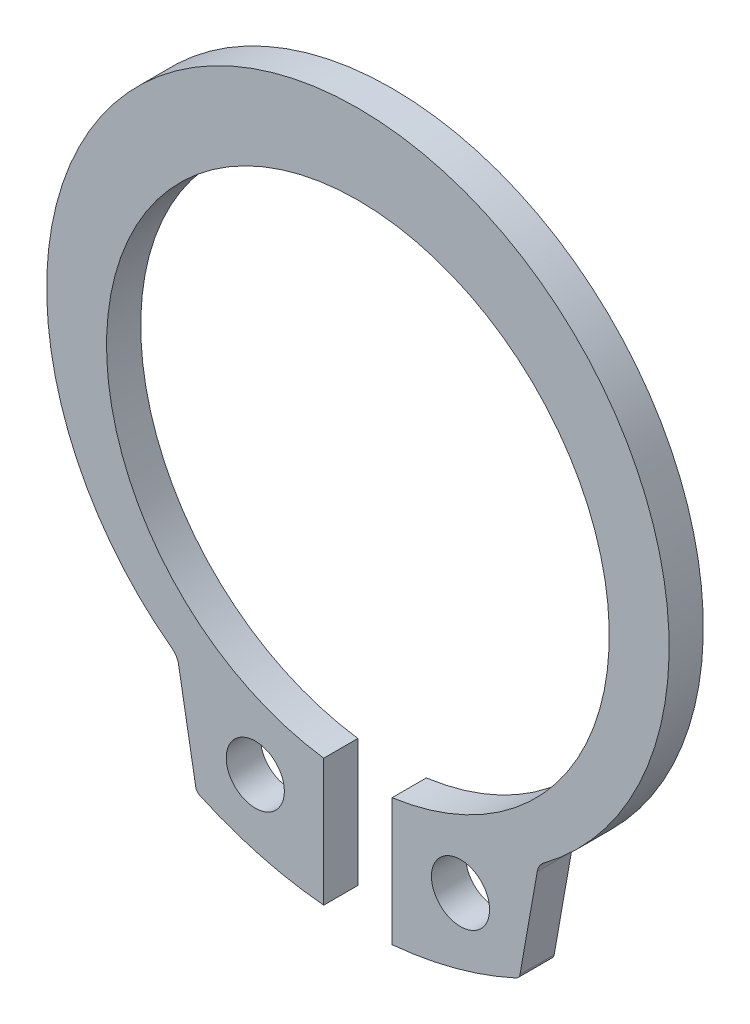
ISO-10303-21;
HEADER;
FILE_DESCRIPTION(('STEP AP214'),'2;1');
FILE_NAME('part.step','',(''),(''),'','','');
FILE_SCHEMA(('AUTOMOTIVE_DESIGN { 1 0 10303 214 1 1 1 1 }'));
ENDSEC;
DATA;
#1=APPLICATION_CONTEXT('core data for automotive mechanical design processes');
#2=APPLICATION_PROTOCOL_DEFINITION('international standard','automotive_design',2000,#1);
#3=PRODUCT_CONTEXT('',#1,'mechanical');
#4=PRODUCT('Part','Part','',(#3));
#5=PRODUCT_RELATED_PRODUCT_CATEGORY('part','',(#4));
#6=PRODUCT_DEFINITION_FORMATION('','',#4);
#7=PRODUCT_DEFINITION_CONTEXT('part definition',#1,'design');
#8=PRODUCT_DEFINITION('design','',#6,#7);
#9=PRODUCT_DEFINITION_SHAPE('','',#8);
#10=(LENGTH_UNIT() NAMED_UNIT(*) SI_UNIT(.MILLI.,.METRE.));
#11=(NAMED_UNIT(*) PLANE_ANGLE_UNIT() SI_UNIT($,.RADIAN.));
#12=(NAMED_UNIT(*) SI_UNIT($,.STERADIAN.) SOLID_ANGLE_UNIT());
#13=UNCERTAINTY_MEASURE_WITH_UNIT(LENGTH_MEASURE(1.E-05),#10,'distance_accuracy_value','');
#14=(GEOMETRIC_REPRESENTATION_CONTEXT(3) GLOBAL_UNCERTAINTY_ASSIGNED_CONTEXT((#13)) GLOBAL_UNIT_ASSIGNED_CONTEXT((#10,
#11,#12)) REPRESENTATION_CONTEXT('',''));
#15=CARTESIAN_POINT('',(0.,0.,0.));
#16=DIRECTION('',(0.,0.,1.));
#17=DIRECTION('',(1.,0.,0.));
#18=AXIS2_PLACEMENT_3D('',#15,#16,#17);
#19=CARTESIAN_POINT('',(0.,-0.58,-1.));
#20=DIRECTION('',(0.,0.,1.));
#21=DIRECTION('',(1.,0.,0.));
#22=AXIS2_PLACEMENT_3D('',#19,#20,#21);
#23=CYLINDRICAL_SURFACE('',#22,11.05);
#24=CARTESIAN_POINT('',(0.,-0.58,-1.));
#25=DIRECTION('',(0.,0.,1.));
#26=DIRECTION('',(-1.,0.,0.));
#27=AXIS2_PLACEMENT_3D('',#24,#25,#26);
#28=CIRCLE('',#27,11.05);
#29=CARTESIAN_POINT('',(1.,-11.5846581046391,-1.));
#30=VERTEX_POINT('',#29);
#31=CARTESIAN_POINT('',(4.62644946881988,-10.6148624959417,-1.));
#32=VERTEX_POINT('',#31);
#33=EDGE_CURVE('E174',#30,#32,#28,.T.);
#34=ORIENTED_EDGE('',*,*,#33,.T.);
#35=DIRECTION('',(0.,0.,1.));
#36=VECTOR('',#35,1.);
#37=CARTESIAN_POINT('',(4.62644946881988,-10.6148624959417,-1.));
#38=LINE('',#37,#36);
#39=CARTESIAN_POINT('',(4.62644946881988,-10.6148624959417,0.));
#40=VERTEX_POINT('',#39);
#41=EDGE_CURVE('E192',#32,#40,#38,.T.);
#42=ORIENTED_EDGE('',*,*,#41,.T.);
#43=CARTESIAN_POINT('',(0.,-0.58,0.));
#44=DIRECTION('',(0.,0.,1.));
#45=DIRECTION('',(-1.,0.,0.));
#46=AXIS2_PLACEMENT_3D('',#43,#44,#45);
#47=CIRCLE('',#46,11.05);
#48=CARTESIAN_POINT('',(1.,-11.5846581046391,0.));
#49=VERTEX_POINT('',#48);
#50=EDGE_CURVE('E154',#49,#40,#47,.T.);
#51=ORIENTED_EDGE('',*,*,#50,.F.);
#52=DIRECTION('',(0.,0.,1.));
#53=VECTOR('',#52,1.);
#54=CARTESIAN_POINT('',(1.,-11.5846581046391,-1.));
#55=LINE('',#54,#53);
#56=EDGE_CURVE('E175',#30,#49,#55,.T.);
#57=ORIENTED_EDGE('',*,*,#56,.F.);
#58=EDGE_LOOP('',(#34,#42,#51,#57));
#59=FACE_BOUND('',#58,.T.);
#60=ADVANCED_FACE('F33',(#59),#23,.T.);
#61=CARTESIAN_POINT('',(1.,-7.86165503165318,-1.));
#62=DIRECTION('',(-1.,0.,0.));
#63=DIRECTION('',(0.,-1.,0.));
#64=AXIS2_PLACEMENT_3D('',#61,#62,#63);
#65=PLANE('',#64);
#66=DIRECTION('',(0.,-1.,0.));
#67=VECTOR('',#66,1.);
#68=CARTESIAN_POINT('',(1.,-7.86165503165318,0.));
#69=LINE('',#68,#67);
#70=CARTESIAN_POINT('',(1.,-7.86165503165318,0.));
#71=VERTEX_POINT('',#70);
#72=EDGE_CURVE('E171',#71,#49,#69,.T.);
#73=ORIENTED_EDGE('',*,*,#72,.F.);
#74=DIRECTION('',(0.,0.,1.));
#75=VECTOR('',#74,1.);
#76=CARTESIAN_POINT('',(1.,-7.86165503165318,-1.));
#77=LINE('',#76,#75);
#78=CARTESIAN_POINT('',(1.,-7.86165503165318,-1.));
#79=VERTEX_POINT('',#78);
#80=EDGE_CURVE('E178',#79,#71,#77,.T.);
#81=ORIENTED_EDGE('',*,*,#80,.F.);
#82=DIRECTION('',(0.,-1.,0.));
#83=VECTOR('',#82,1.);
#84=CARTESIAN_POINT('',(1.,-7.86165503165318,-1.));
#85=LINE('',#84,#83);
#86=EDGE_CURVE('E141',#79,#30,#85,.T.);
#87=ORIENTED_EDGE('',*,*,#86,.T.);
#88=ORIENTED_EDGE('',*,*,#56,.T.);
#89=EDGE_LOOP('',(#73,#81,#87,#88));
#90=FACE_BOUND('',#89,.T.);
#91=ADVANCED_FACE('F273',(#90),#65,.T.);
#92=CARTESIAN_POINT('',(0.,-0.58,-1.));
#93=DIRECTION('',(0.,0.,1.));
#94=DIRECTION('',(1.,0.,0.));
#95=AXIS2_PLACEMENT_3D('',#92,#93,#94);
#96=CYLINDRICAL_SURFACE('',#95,7.35);
#97=CARTESIAN_POINT('',(0.,-0.58,0.));
#98=DIRECTION('',(0.,0.,-1.));
#99=DIRECTION('',(1.,0.,0.));
#100=AXIS2_PLACEMENT_3D('',#97,#98,#99);
#101=CIRCLE('',#100,7.35);
#102=CARTESIAN_POINT('',(-1.,-7.86165503165318,0.));
#103=VERTEX_POINT('',#102);
#104=EDGE_CURVE('E168',#103,#71,#101,.T.);
#105=ORIENTED_EDGE('',*,*,#104,.F.);
#106=DIRECTION('',(0.,0.,1.));
#107=VECTOR('',#106,1.);
#108=CARTESIAN_POINT('',(-1.,-7.86165503165318,-1.));
#109=LINE('',#108,#107);
#110=CARTESIAN_POINT('',(-1.,-7.86165503165318,-1.));
#111=VERTEX_POINT('',#110);
#112=EDGE_CURVE('E140',#111,#103,#109,.T.);
#113=ORIENTED_EDGE('',*,*,#112,.F.);
#114=CARTESIAN_POINT('',(0.,-0.58,-1.));
#115=DIRECTION('',(0.,0.,-1.));
#116=DIRECTION('',(1.,0.,0.));
#117=AXIS2_PLACEMENT_3D('',#114,#115,#116);
#118=CIRCLE('',#117,7.35);
#119=EDGE_CURVE('E147',#111,#79,#118,.T.);
#120=ORIENTED_EDGE('',*,*,#119,.T.);
#121=ORIENTED_EDGE('',*,*,#80,.T.);
#122=EDGE_LOOP('',(#105,#113,#120,#121));
#123=FACE_BOUND('',#122,.T.);
#124=ADVANCED_FACE('F279',(#123),#96,.F.);
#125=CARTESIAN_POINT('',(-1.,-7.86165503165318,-1.));
#126=DIRECTION('',(1.,0.,0.));
#127=DIRECTION('',(0.,1.,0.));
#128=AXIS2_PLACEMENT_3D('',#125,#126,#127);
#129=PLANE('',#128);
#130=DIRECTION('',(0.,1.,0.));
#131=VECTOR('',#130,1.);
#132=CARTESIAN_POINT('',(-1.,-7.86165503165318,0.));
#133=LINE('',#132,#131);
#134=CARTESIAN_POINT('',(-1.,-11.5846581046391,0.));
#135=VERTEX_POINT('',#134);
#136=EDGE_CURVE('E139',#135,#103,#133,.T.);
#137=ORIENTED_EDGE('',*,*,#136,.F.);
#138=DIRECTION('',(0.,0.,1.));
#139=VECTOR('',#138,1.);
#140=CARTESIAN_POINT('',(-1.,-11.5846581046391,-1.));
#141=LINE('',#140,#139);
#142=CARTESIAN_POINT('',(-1.,-11.5846581046391,-1.));
#143=VERTEX_POINT('',#142);
#144=EDGE_CURVE('E124',#143,#135,#141,.T.);
#145=ORIENTED_EDGE('',*,*,#144,.F.);
#146=DIRECTION('',(0.,1.,0.));
#147=VECTOR('',#146,1.);
#148=CARTESIAN_POINT('',(-1.,-7.86165503165318,-1.));
#149=LINE('',#148,#147);
#150=EDGE_CURVE('E132',#143,#111,#149,.T.);
#151=ORIENTED_EDGE('',*,*,#150,.T.);
#152=ORIENTED_EDGE('',*,*,#112,.T.);
#153=EDGE_LOOP('',(#137,#145,#151,#152));
#154=FACE_BOUND('',#153,.T.);
#155=ADVANCED_FACE('F137',(#154),#129,.T.);
#156=CARTESIAN_POINT('',(0.,-0.58,-1.));
#157=DIRECTION('',(0.,0.,1.));
#158=DIRECTION('',(1.,0.,0.));
#159=AXIS2_PLACEMENT_3D('',#156,#157,#158);
#160=CYLINDRICAL_SURFACE('',#159,11.05);
#161=CARTESIAN_POINT('',(0.,-0.58,0.));
#162=DIRECTION('',(0.,0.,1.));
#163=DIRECTION('',(1.,0.,0.));
#164=AXIS2_PLACEMENT_3D('',#161,#162,#163);
#165=CIRCLE('',#164,11.05);
#166=CARTESIAN_POINT('',(-4.62644946881988,-10.6148624959417,0.));
#167=VERTEX_POINT('',#166);
#168=EDGE_CURVE('E165',#167,#135,#165,.T.);
#169=ORIENTED_EDGE('',*,*,#168,.F.);
#170=DIRECTION('',(0.,0.,1.));
#171=VECTOR('',#170,1.);
#172=CARTESIAN_POINT('',(-4.62644946881988,-10.6148624959417,-1.));
#173=LINE('',#172,#171);
#174=CARTESIAN_POINT('',(-4.62644946881988,-10.6148624959417,-1.));
#175=VERTEX_POINT('',#174);
#176=EDGE_CURVE('E127',#167,#175,#173,.F.);
#177=ORIENTED_EDGE('',*,*,#176,.T.);
#178=CARTESIAN_POINT('',(0.,-0.58,-1.));
#179=DIRECTION('',(0.,0.,1.));
#180=DIRECTION('',(1.,0.,0.));
#181=AXIS2_PLACEMENT_3D('',#178,#179,#180);
#182=CIRCLE('',#181,11.05);
#183=EDGE_CURVE('E120',#175,#143,#182,.T.);
#184=ORIENTED_EDGE('',*,*,#183,.T.);
#185=ORIENTED_EDGE('',*,*,#144,.T.);
#186=EDGE_LOOP('',(#169,#177,#184,#185));
#187=FACE_BOUND('',#186,.T.);
#188=ADVANCED_FACE('F123',(#187),#160,.T.);
#189=CARTESIAN_POINT('',(-5.27839510605445,-7.41272858699011,-1.));
#190=DIRECTION('',(-0.984807753012208,-0.173648177666931,0.));
#191=DIRECTION('',(0.173648177666931,-0.984807753012208,0.));
#192=AXIS2_PLACEMENT_3D('',#189,#190,#191);
#193=PLANE('',#192);
#194=DIRECTION('',(0.173648177666931,-0.984807753012208,0.));
#195=VECTOR('',#194,1.);
#196=CARTESIAN_POINT('',(-5.27839510605445,-7.41272858699011,0.));
#197=LINE('',#196,#195);
#198=CARTESIAN_POINT('',(-5.24338621796162,-7.61127385755602,0.));
#199=VERTEX_POINT('',#198);
#200=CARTESIAN_POINT('',(-4.73967437745273,-10.4679656609603,0.));
#201=VERTEX_POINT('',#200);
#202=EDGE_CURVE('E163',#199,#201,#197,.T.);
#203=ORIENTED_EDGE('',*,*,#202,.F.);
#204=DIRECTION('',(0.,0.,-1.));
#205=VECTOR('',#204,1.);
#206=CARTESIAN_POINT('',(-5.24338621796162,-7.61127385755602,-1.));
#207=LINE('',#206,#205);
#208=CARTESIAN_POINT('',(-5.24338621796162,-7.61127385755602,-1.));
#209=VERTEX_POINT('',#208);
#210=EDGE_CURVE('E54',#199,#209,#207,.T.);
#211=ORIENTED_EDGE('',*,*,#210,.T.);
#212=DIRECTION('',(0.173648177666931,-0.984807753012208,0.));
#213=VECTOR('',#212,1.);
#214=CARTESIAN_POINT('',(-5.27839510605445,-7.41272858699011,-1.));
#215=LINE('',#214,#213);
#216=CARTESIAN_POINT('',(-4.73967437745273,-10.4679656609603,-1.));
#217=VERTEX_POINT('',#216);
#218=EDGE_CURVE('E133',#209,#217,#215,.T.);
#219=ORIENTED_EDGE('',*,*,#218,.T.);
#220=DIRECTION('',(0.,0.,1.));
#221=VECTOR('',#220,1.);
#222=CARTESIAN_POINT('',(-4.73967437745273,-10.4679656609603,-1.));
#223=LINE('',#222,#221);
#224=EDGE_CURVE('E177',#217,#201,#223,.T.);
#225=ORIENTED_EDGE('',*,*,#224,.T.);
#226=EDGE_LOOP('',(#203,#211,#219,#225));
#227=FACE_BOUND('',#226,.T.);
#228=ADVANCED_FACE('F332',(#227),#193,.T.);
#229=CARTESIAN_POINT('',(0.,0.,-1.));
#230=DIRECTION('',(0.,0.,1.));
#231=DIRECTION('',(1.,0.,0.));
#232=AXIS2_PLACEMENT_3D('',#229,#230,#231);
#233=CYLINDRICAL_SURFACE('',#232,9.1);
#234=CARTESIAN_POINT('',(0.,0.,0.));
#235=DIRECTION('',(0.,0.,1.));
#236=DIRECTION('',(1.,0.,0.));
#237=AXIS2_PLACEMENT_3D('',#234,#235,#236);
#238=CIRCLE('',#237,9.1);
#239=CARTESIAN_POINT('',(5.43705102704753,-7.29715534501503,0.));
#240=VERTEX_POINT('',#239);
#241=CARTESIAN_POINT('',(-5.43705102704753,-7.29715534501503,0.));
#242=VERTEX_POINT('',#241);
#243=EDGE_CURVE('E161',#240,#242,#238,.T.);
#244=ORIENTED_EDGE('',*,*,#243,.F.);
#245=DIRECTION('',(0.,0.,1.));
#246=VECTOR('',#245,1.);
#247=CARTESIAN_POINT('',(5.43705102704753,-7.29715534501503,-1.));
#248=LINE('',#247,#246);
#249=CARTESIAN_POINT('',(5.43705102704753,-7.29715534501503,-1.));
#250=VERTEX_POINT('',#249);
#251=EDGE_CURVE('E203',#240,#250,#248,.F.);
#252=ORIENTED_EDGE('',*,*,#251,.T.);
#253=CARTESIAN_POINT('',(0.,0.,-1.));
#254=DIRECTION('',(0.,0.,1.));
#255=DIRECTION('',(1.,0.,0.));
#256=AXIS2_PLACEMENT_3D('',#253,#254,#255);
#257=CIRCLE('',#256,9.1);
#258=CARTESIAN_POINT('',(-5.43705102704753,-7.29715534501503,-1.));
#259=VERTEX_POINT('',#258);
#260=EDGE_CURVE('E216',#250,#259,#257,.T.);
#261=ORIENTED_EDGE('',*,*,#260,.T.);
#262=DIRECTION('',(0.,0.,1.));
#263=VECTOR('',#262,1.);
#264=CARTESIAN_POINT('',(-5.43705102704753,-7.29715534501503,-1.));
#265=LINE('',#264,#263);
#266=EDGE_CURVE('E200',#259,#242,#265,.T.);
#267=ORIENTED_EDGE('',*,*,#266,.T.);
#268=EDGE_LOOP('',(#244,#252,#261,#267));
#269=FACE_BOUND('',#268,.T.);
#270=ADVANCED_FACE('F229',(#269),#233,.T.);
#271=CARTESIAN_POINT('',(5.27839510605445,-7.41272858699011,-1.));
#272=DIRECTION('',(0.984807753012208,-0.173648177666931,0.));
#273=DIRECTION('',(0.173648177666931,0.984807753012208,0.));
#274=AXIS2_PLACEMENT_3D('',#271,#272,#273);
#275=PLANE('',#274);
#276=DIRECTION('',(0.173648177666931,0.984807753012208,0.));
#277=VECTOR('',#276,1.);
#278=CARTESIAN_POINT('',(5.27839510605445,-7.41272858699011,-1.));
#279=LINE('',#278,#277);
#280=CARTESIAN_POINT('',(4.73967437745273,-10.4679656609603,-1.));
#281=VERTEX_POINT('',#280);
#282=CARTESIAN_POINT('',(5.24338621796162,-7.61127385755602,-1.));
#283=VERTEX_POINT('',#282);
#284=EDGE_CURVE('E213',#281,#283,#279,.T.);
#285=ORIENTED_EDGE('',*,*,#284,.T.);
#286=DIRECTION('',(0.,0.,-1.));
#287=VECTOR('',#286,1.);
#288=CARTESIAN_POINT('',(5.24338621796162,-7.61127385755602,0.));
#289=LINE('',#288,#287);
#290=CARTESIAN_POINT('',(5.24338621796162,-7.61127385755602,0.));
#291=VERTEX_POINT('',#290);
#292=EDGE_CURVE('E197',#283,#291,#289,.F.);
#293=ORIENTED_EDGE('',*,*,#292,.T.);
#294=DIRECTION('',(0.173648177666931,0.984807753012208,0.));
#295=VECTOR('',#294,1.);
#296=CARTESIAN_POINT('',(5.27839510605445,-7.41272858699011,0.));
#297=LINE('',#296,#295);
#298=CARTESIAN_POINT('',(4.73967437745273,-10.4679656609603,0.));
#299=VERTEX_POINT('',#298);
#300=EDGE_CURVE('E157',#299,#291,#297,.T.);
#301=ORIENTED_EDGE('',*,*,#300,.F.);
#302=DIRECTION('',(0.,0.,1.));
#303=VECTOR('',#302,1.);
#304=CARTESIAN_POINT('',(4.73967437745273,-10.4679656609603,-1.));
#305=LINE('',#304,#303);
#306=EDGE_CURVE('E195',#299,#281,#305,.F.);
#307=ORIENTED_EDGE('',*,*,#306,.T.);
#308=EDGE_LOOP('',(#285,#293,#301,#307));
#309=FACE_BOUND('',#308,.T.);
#310=ADVANCED_FACE('F221',(#309),#275,.T.);
#311=CARTESIAN_POINT('',(0.,-0.58,-1.));
#312=DIRECTION('',(0.,0.,-1.));
#313=DIRECTION('',(-1.,0.,0.));
#314=AXIS2_PLACEMENT_3D('',#311,#312,#313);
#315=PLANE('',#314);
#316=CARTESIAN_POINT('',(3.,-9.27712596206356,-1.));
#317=DIRECTION('',(0.,0.,1.));
#318=DIRECTION('',(-1.,0.,0.));
#319=AXIS2_PLACEMENT_3D('',#316,#317,#318);
#320=CIRCLE('',#319,0.85);
#321=CARTESIAN_POINT('',(2.15,-9.27712596206356,-1.));
#322=VERTEX_POINT('',#321);
#323=EDGE_CURVE('E241',#322,#322,#320,.T.);
#324=ORIENTED_EDGE('',*,*,#323,.T.);
#325=EDGE_LOOP('',(#324));
#326=FACE_BOUND('',#325,.T.);
#327=CARTESIAN_POINT('',(-3.,-9.27712596206356,-1.));
#328=DIRECTION('',(0.,0.,1.));
#329=DIRECTION('',(1.,0.,0.));
#330=AXIS2_PLACEMENT_3D('',#327,#328,#329);
#331=CIRCLE('',#330,0.85);
#332=CARTESIAN_POINT('',(-2.15,-9.27712596206356,-1.));
#333=VERTEX_POINT('',#332);
#334=EDGE_CURVE('E158',#333,#333,#331,.T.);
#335=ORIENTED_EDGE('',*,*,#334,.T.);
#336=EDGE_LOOP('',(#335));
#337=FACE_BOUND('',#336,.T.);
#338=ORIENTED_EDGE('',*,*,#183,.F.);
#339=CARTESIAN_POINT('',(-4.54271282685029,-10.4332360254269,-1.));
#340=DIRECTION('',(0.,0.,-1.));
#341=DIRECTION('',(-1.,0.,0.));
#342=AXIS2_PLACEMENT_3D('',#339,#340,#341);
#343=CIRCLE('',#342,0.2);
#344=EDGE_CURVE('E190',#175,#217,#343,.T.);
#345=ORIENTED_EDGE('',*,*,#344,.T.);
#346=ORIENTED_EDGE('',*,*,#218,.F.);
#347=CARTESIAN_POINT('',(-5.73579009446773,-7.69809794638948,-1.));
#348=DIRECTION('',(0.,0.,-1.));
#349=DIRECTION('',(-1.,0.,0.));
#350=AXIS2_PLACEMENT_3D('',#347,#348,#349);
#351=CIRCLE('',#350,0.5);
#352=EDGE_CURVE('E11',#209,#259,#351,.F.);
#353=ORIENTED_EDGE('',*,*,#352,.T.);
#354=ORIENTED_EDGE('',*,*,#260,.F.);
#355=CARTESIAN_POINT('',(5.73579009446773,-7.69809794638948,-1.));
#356=DIRECTION('',(0.,0.,-1.));
#357=DIRECTION('',(-1.,0.,0.));
#358=AXIS2_PLACEMENT_3D('',#355,#356,#357);
#359=CIRCLE('',#358,0.5);
#360=EDGE_CURVE('E208',#250,#283,#359,.F.);
#361=ORIENTED_EDGE('',*,*,#360,.T.);
#362=ORIENTED_EDGE('',*,*,#284,.F.);
#363=CARTESIAN_POINT('',(4.54271282685029,-10.4332360254269,-1.));
#364=DIRECTION('',(0.,0.,-1.));
#365=DIRECTION('',(-1.,0.,0.));
#366=AXIS2_PLACEMENT_3D('',#363,#364,#365);
#367=CIRCLE('',#366,0.2);
#368=EDGE_CURVE('E188',#281,#32,#367,.T.);
#369=ORIENTED_EDGE('',*,*,#368,.T.);
#370=ORIENTED_EDGE('',*,*,#33,.F.);
#371=ORIENTED_EDGE('',*,*,#86,.F.);
#372=ORIENTED_EDGE('',*,*,#119,.F.);
#373=ORIENTED_EDGE('',*,*,#150,.F.);
#374=EDGE_LOOP('',(#338,#345,#346,#353,#354,#361,#362,#369,#370,#371,#372,#373));
#375=FACE_BOUND('',#374,.T.);
#376=ADVANCED_FACE('F144',(#326,#337,#375),#315,.T.);
#377=CARTESIAN_POINT('',(0.,-0.58,0.));
#378=DIRECTION('',(0.,0.,-1.));
#379=DIRECTION('',(-1.,0.,0.));
#380=AXIS2_PLACEMENT_3D('',#377,#378,#379);
#381=PLANE('',#380);
#382=CARTESIAN_POINT('',(3.,-9.27712596206356,0.));
#383=DIRECTION('',(0.,0.,1.));
#384=DIRECTION('',(-1.,0.,0.));
#385=AXIS2_PLACEMENT_3D('',#382,#383,#384);
#386=CIRCLE('',#385,0.85);
#387=CARTESIAN_POINT('',(2.15,-9.27712596206356,0.));
#388=VERTEX_POINT('',#387);
#389=EDGE_CURVE('E244',#388,#388,#386,.T.);
#390=ORIENTED_EDGE('',*,*,#389,.F.);
#391=EDGE_LOOP('',(#390));
#392=FACE_BOUND('',#391,.T.);
#393=CARTESIAN_POINT('',(-3.,-9.27712596206356,0.));
#394=DIRECTION('',(0.,0.,1.));
#395=DIRECTION('',(1.,0.,0.));
#396=AXIS2_PLACEMENT_3D('',#393,#394,#395);
#397=CIRCLE('',#396,0.85);
#398=CARTESIAN_POINT('',(-2.15,-9.27712596206356,0.));
#399=VERTEX_POINT('',#398);
#400=EDGE_CURVE('E238',#399,#399,#397,.T.);
#401=ORIENTED_EDGE('',*,*,#400,.F.);
#402=EDGE_LOOP('',(#401));
#403=FACE_BOUND('',#402,.T.);
#404=ORIENTED_EDGE('',*,*,#243,.T.);
#405=CARTESIAN_POINT('',(-5.73579009446773,-7.69809794638948,0.));
#406=DIRECTION('',(0.,0.,-1.));
#407=DIRECTION('',(-1.,0.,0.));
#408=AXIS2_PLACEMENT_3D('',#405,#406,#407);
#409=CIRCLE('',#408,0.5);
#410=EDGE_CURVE('E41',#242,#199,#409,.T.);
#411=ORIENTED_EDGE('',*,*,#410,.T.);
#412=ORIENTED_EDGE('',*,*,#202,.T.);
#413=CARTESIAN_POINT('',(-4.54271282685029,-10.4332360254269,0.));
#414=DIRECTION('',(0.,0.,-1.));
#415=DIRECTION('',(-1.,0.,0.));
#416=AXIS2_PLACEMENT_3D('',#413,#414,#415);
#417=CIRCLE('',#416,0.2);
#418=EDGE_CURVE('E185',#201,#167,#417,.F.);
#419=ORIENTED_EDGE('',*,*,#418,.T.);
#420=ORIENTED_EDGE('',*,*,#168,.T.);
#421=ORIENTED_EDGE('',*,*,#136,.T.);
#422=ORIENTED_EDGE('',*,*,#104,.T.);
#423=ORIENTED_EDGE('',*,*,#72,.T.);
#424=ORIENTED_EDGE('',*,*,#50,.T.);
#425=CARTESIAN_POINT('',(4.54271282685029,-10.4332360254269,0.));
#426=DIRECTION('',(0.,0.,-1.));
#427=DIRECTION('',(-1.,0.,0.));
#428=AXIS2_PLACEMENT_3D('',#425,#426,#427);
#429=CIRCLE('',#428,0.2);
#430=EDGE_CURVE('E183',#40,#299,#429,.F.);
#431=ORIENTED_EDGE('',*,*,#430,.T.);
#432=ORIENTED_EDGE('',*,*,#300,.T.);
#433=CARTESIAN_POINT('',(5.73579009446773,-7.69809794638948,0.));
#434=DIRECTION('',(0.,0.,-1.));
#435=DIRECTION('',(-1.,0.,0.));
#436=AXIS2_PLACEMENT_3D('',#433,#434,#435);
#437=CIRCLE('',#436,0.5);
#438=EDGE_CURVE('E206',#291,#240,#437,.T.);
#439=ORIENTED_EDGE('',*,*,#438,.T.);
#440=EDGE_LOOP('',(#404,#411,#412,#419,#420,#421,#422,#423,#424,#431,#432,#439));
#441=FACE_BOUND('',#440,.T.);
#442=ADVANCED_FACE('F227',(#392,#403,#441),#381,.F.);
#443=CARTESIAN_POINT('',(-3.,-9.27712596206356,-1.));
#444=DIRECTION('',(0.,0.,1.));
#445=DIRECTION('',(1.,0.,0.));
#446=AXIS2_PLACEMENT_3D('',#443,#444,#445);
#447=CYLINDRICAL_SURFACE('',#446,0.85);
#448=ORIENTED_EDGE('',*,*,#334,.F.);
#449=EDGE_LOOP('',(#448));
#450=FACE_BOUND('',#449,.T.);
#451=ORIENTED_EDGE('',*,*,#400,.T.);
#452=EDGE_LOOP('',(#451));
#453=FACE_BOUND('',#452,.T.);
#454=ADVANCED_FACE('F256',(#450,#453),#447,.F.);
#455=CARTESIAN_POINT('',(3.,-9.27712596206356,-1.));
#456=DIRECTION('',(0.,0.,1.));
#457=DIRECTION('',(1.,0.,0.));
#458=AXIS2_PLACEMENT_3D('',#455,#456,#457);
#459=CYLINDRICAL_SURFACE('',#458,0.85);
#460=ORIENTED_EDGE('',*,*,#323,.F.);
#461=EDGE_LOOP('',(#460));
#462=FACE_BOUND('',#461,.T.);
#463=ORIENTED_EDGE('',*,*,#389,.T.);
#464=EDGE_LOOP('',(#463));
#465=FACE_BOUND('',#464,.T.);
#466=ADVANCED_FACE('F252',(#462,#465),#459,.F.);
#467=CARTESIAN_POINT('',(-4.54271282685029,-10.4332360254269,-1.));
#468=DIRECTION('',(0.,0.,1.));
#469=DIRECTION('',(1.,0.,0.));
#470=AXIS2_PLACEMENT_3D('',#467,#468,#469);
#471=CYLINDRICAL_SURFACE('',#470,0.2);
#472=ORIENTED_EDGE('',*,*,#344,.F.);
#473=ORIENTED_EDGE('',*,*,#176,.F.);
#474=ORIENTED_EDGE('',*,*,#418,.F.);
#475=ORIENTED_EDGE('',*,*,#224,.F.);
#476=EDGE_LOOP('',(#472,#473,#474,#475));
#477=FACE_BOUND('',#476,.T.);
#478=ADVANCED_FACE('F255',(#477),#471,.T.);
#479=CARTESIAN_POINT('',(4.54271282685029,-10.4332360254269,-1.));
#480=DIRECTION('',(0.,0.,1.));
#481=DIRECTION('',(1.,0.,0.));
#482=AXIS2_PLACEMENT_3D('',#479,#480,#481);
#483=CYLINDRICAL_SURFACE('',#482,0.2);
#484=ORIENTED_EDGE('',*,*,#368,.F.);
#485=ORIENTED_EDGE('',*,*,#306,.F.);
#486=ORIENTED_EDGE('',*,*,#430,.F.);
#487=ORIENTED_EDGE('',*,*,#41,.F.);
#488=EDGE_LOOP('',(#484,#485,#486,#487));
#489=FACE_BOUND('',#488,.T.);
#490=ADVANCED_FACE('F287',(#489),#483,.T.);
#491=CARTESIAN_POINT('',(5.73579009446773,-7.69809794638948,-1.));
#492=DIRECTION('',(0.,0.,1.));
#493=DIRECTION('',(1.,0.,0.));
#494=AXIS2_PLACEMENT_3D('',#491,#492,#493);
#495=CYLINDRICAL_SURFACE('',#494,0.5);
#496=ORIENTED_EDGE('',*,*,#360,.F.);
#497=ORIENTED_EDGE('',*,*,#251,.F.);
#498=ORIENTED_EDGE('',*,*,#438,.F.);
#499=ORIENTED_EDGE('',*,*,#292,.F.);
#500=EDGE_LOOP('',(#496,#497,#498,#499));
#501=FACE_BOUND('',#500,.T.);
#502=ADVANCED_FACE('F225',(#501),#495,.F.);
#503=CARTESIAN_POINT('',(-5.73579009446773,-7.69809794638948,-1.));
#504=DIRECTION('',(0.,0.,1.));
#505=DIRECTION('',(1.,0.,0.));
#506=AXIS2_PLACEMENT_3D('',#503,#504,#505);
#507=CYLINDRICAL_SURFACE('',#506,0.5);
#508=ORIENTED_EDGE('',*,*,#352,.F.);
#509=ORIENTED_EDGE('',*,*,#210,.F.);
#510=ORIENTED_EDGE('',*,*,#410,.F.);
#511=ORIENTED_EDGE('',*,*,#266,.F.);
#512=EDGE_LOOP('',(#508,#509,#510,#511));
#513=FACE_BOUND('',#512,.T.);
#514=ADVANCED_FACE('F35',(#513),#507,.F.);
#515=CLOSED_SHELL('',(#60,#91,#124,#155,#188,#228,#270,#310,#376,#442,#454,#466,#478,#490,#502,#514));
#516=MANIFOLD_SOLID_BREP('B2',#515);
#517=ADVANCED_BREP_SHAPE_REPRESENTATION('',(#18,#516),#14);
#518=SHAPE_DEFINITION_REPRESENTATION(#9,#517);
ENDSEC;
END-ISO-10303-21;
